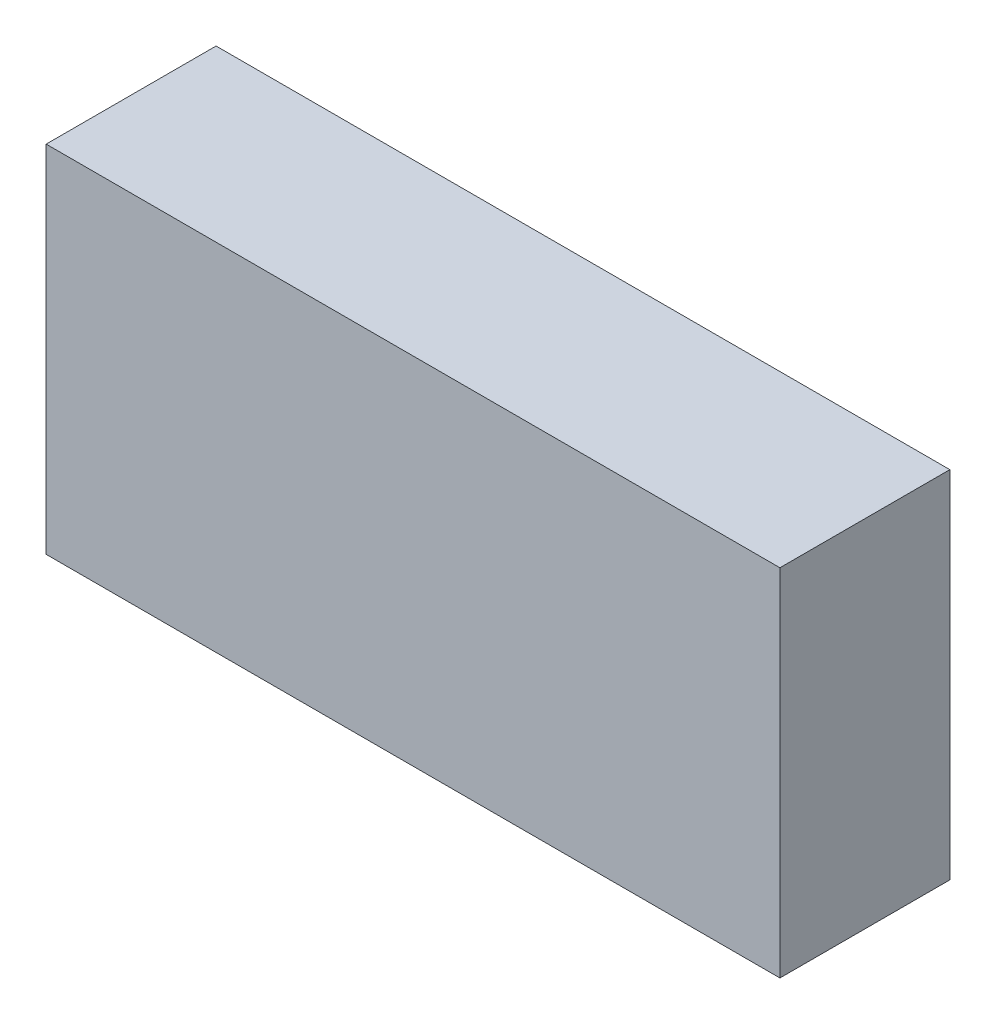
ISO-10303-21;
HEADER;
FILE_DESCRIPTION(('STEP AP214'),'2;1');
FILE_NAME('part.step','',(''),(''),'','','');
FILE_SCHEMA(('AUTOMOTIVE_DESIGN { 1 0 10303 214 1 1 1 1 }'));
ENDSEC;
DATA;
#1=APPLICATION_CONTEXT('core data for automotive mechanical design processes');
#2=APPLICATION_PROTOCOL_DEFINITION('international standard','automotive_design',2000,#1);
#3=PRODUCT_CONTEXT('',#1,'mechanical');
#4=PRODUCT('Part','Part','',(#3));
#5=PRODUCT_RELATED_PRODUCT_CATEGORY('part','',(#4));
#6=PRODUCT_DEFINITION_FORMATION('','',#4);
#7=PRODUCT_DEFINITION_CONTEXT('part definition',#1,'design');
#8=PRODUCT_DEFINITION('design','',#6,#7);
#9=PRODUCT_DEFINITION_SHAPE('','',#8);
#10=(LENGTH_UNIT() NAMED_UNIT(*) SI_UNIT(.MILLI.,.METRE.));
#11=(NAMED_UNIT(*) PLANE_ANGLE_UNIT() SI_UNIT($,.RADIAN.));
#12=(NAMED_UNIT(*) SI_UNIT($,.STERADIAN.) SOLID_ANGLE_UNIT());
#13=UNCERTAINTY_MEASURE_WITH_UNIT(LENGTH_MEASURE(1.E-05),#10,'distance_accuracy_value','');
#14=(GEOMETRIC_REPRESENTATION_CONTEXT(3) GLOBAL_UNCERTAINTY_ASSIGNED_CONTEXT((#13)) GLOBAL_UNIT_ASSIGNED_CONTEXT((#10,
#11,#12)) REPRESENTATION_CONTEXT('',''));
#15=CARTESIAN_POINT('',(0.,0.,0.));
#16=DIRECTION('',(0.,0.,1.));
#17=DIRECTION('',(1.,0.,0.));
#18=AXIS2_PLACEMENT_3D('',#15,#16,#17);
#19=CARTESIAN_POINT('',(47.5,23.,22.));
#20=DIRECTION('',(-1.,0.,0.));
#21=DIRECTION('',(0.,0.,1.));
#22=AXIS2_PLACEMENT_3D('',#19,#20,#21);
#23=PLANE('',#22);
#24=DIRECTION('',(0.,1.,0.));
#25=VECTOR('',#24,1.);
#26=CARTESIAN_POINT('',(47.5,23.,0.));
#27=LINE('',#26,#25);
#28=CARTESIAN_POINT('',(47.5,-23.,0.));
#29=VERTEX_POINT('',#28);
#30=CARTESIAN_POINT('',(47.5,23.,0.));
#31=VERTEX_POINT('',#30);
#32=EDGE_CURVE('E96',#29,#31,#27,.T.);
#33=ORIENTED_EDGE('',*,*,#32,.T.);
#34=DIRECTION('',(0.,0.,-1.));
#35=VECTOR('',#34,1.);
#36=CARTESIAN_POINT('',(47.5,23.,22.));
#37=LINE('',#36,#35);
#38=CARTESIAN_POINT('',(47.5,23.,22.));
#39=VERTEX_POINT('',#38);
#40=EDGE_CURVE('E11',#39,#31,#37,.T.);
#41=ORIENTED_EDGE('',*,*,#40,.F.);
#42=DIRECTION('',(0.,1.,0.));
#43=VECTOR('',#42,1.);
#44=CARTESIAN_POINT('',(47.5,23.,22.));
#45=LINE('',#44,#43);
#46=CARTESIAN_POINT('',(47.5,-23.,22.));
#47=VERTEX_POINT('',#46);
#48=EDGE_CURVE('E84',#47,#39,#45,.T.);
#49=ORIENTED_EDGE('',*,*,#48,.F.);
#50=DIRECTION('',(0.,0.,-1.));
#51=VECTOR('',#50,1.);
#52=CARTESIAN_POINT('',(47.5,-23.,22.));
#53=LINE('',#52,#51);
#54=EDGE_CURVE('E92',#47,#29,#53,.T.);
#55=ORIENTED_EDGE('',*,*,#54,.T.);
#56=EDGE_LOOP('',(#33,#41,#49,#55));
#57=FACE_BOUND('',#56,.T.);
#58=ADVANCED_FACE('F33',(#57),#23,.F.);
#59=CARTESIAN_POINT('',(-47.5,23.,22.));
#60=DIRECTION('',(0.,-1.,0.));
#61=DIRECTION('',(0.,0.,-1.));
#62=AXIS2_PLACEMENT_3D('',#59,#60,#61);
#63=PLANE('',#62);
#64=DIRECTION('',(-1.,0.,0.));
#65=VECTOR('',#64,1.);
#66=CARTESIAN_POINT('',(-47.5,23.,0.));
#67=LINE('',#66,#65);
#68=CARTESIAN_POINT('',(-47.5,23.,0.));
#69=VERTEX_POINT('',#68);
#70=EDGE_CURVE('E88',#31,#69,#67,.T.);
#71=ORIENTED_EDGE('',*,*,#70,.T.);
#72=DIRECTION('',(0.,0.,-1.));
#73=VECTOR('',#72,1.);
#74=CARTESIAN_POINT('',(-47.5,23.,22.));
#75=LINE('',#74,#73);
#76=CARTESIAN_POINT('',(-47.5,23.,22.));
#77=VERTEX_POINT('',#76);
#78=EDGE_CURVE('E41',#77,#69,#75,.T.);
#79=ORIENTED_EDGE('',*,*,#78,.F.);
#80=DIRECTION('',(-1.,0.,0.));
#81=VECTOR('',#80,1.);
#82=CARTESIAN_POINT('',(-47.5,23.,22.));
#83=LINE('',#82,#81);
#84=EDGE_CURVE('E79',#39,#77,#83,.T.);
#85=ORIENTED_EDGE('',*,*,#84,.F.);
#86=ORIENTED_EDGE('',*,*,#40,.T.);
#87=EDGE_LOOP('',(#71,#79,#85,#86));
#88=FACE_BOUND('',#87,.T.);
#89=ADVANCED_FACE('F87',(#88),#63,.F.);
#90=CARTESIAN_POINT('',(-47.5,23.,22.));
#91=DIRECTION('',(1.,0.,0.));
#92=DIRECTION('',(0.,0.,-1.));
#93=AXIS2_PLACEMENT_3D('',#90,#91,#92);
#94=PLANE('',#93);
#95=DIRECTION('',(0.,-1.,0.));
#96=VECTOR('',#95,1.);
#97=CARTESIAN_POINT('',(-47.5,23.,0.));
#98=LINE('',#97,#96);
#99=CARTESIAN_POINT('',(-47.5,-23.,0.));
#100=VERTEX_POINT('',#99);
#101=EDGE_CURVE('E66',#69,#100,#98,.T.);
#102=ORIENTED_EDGE('',*,*,#101,.T.);
#103=DIRECTION('',(0.,0.,-1.));
#104=VECTOR('',#103,1.);
#105=CARTESIAN_POINT('',(-47.5,-23.,22.));
#106=LINE('',#105,#104);
#107=CARTESIAN_POINT('',(-47.5,-23.,22.));
#108=VERTEX_POINT('',#107);
#109=EDGE_CURVE('E89',#108,#100,#106,.T.);
#110=ORIENTED_EDGE('',*,*,#109,.F.);
#111=DIRECTION('',(0.,-1.,0.));
#112=VECTOR('',#111,1.);
#113=CARTESIAN_POINT('',(-47.5,23.,22.));
#114=LINE('',#113,#112);
#115=EDGE_CURVE('E82',#77,#108,#114,.T.);
#116=ORIENTED_EDGE('',*,*,#115,.F.);
#117=ORIENTED_EDGE('',*,*,#78,.T.);
#118=EDGE_LOOP('',(#102,#110,#116,#117));
#119=FACE_BOUND('',#118,.T.);
#120=ADVANCED_FACE('F90',(#119),#94,.F.);
#121=CARTESIAN_POINT('',(-47.5,-23.,22.));
#122=DIRECTION('',(0.,1.,0.));
#123=DIRECTION('',(0.,0.,1.));
#124=AXIS2_PLACEMENT_3D('',#121,#122,#123);
#125=PLANE('',#124);
#126=DIRECTION('',(1.,0.,0.));
#127=VECTOR('',#126,1.);
#128=CARTESIAN_POINT('',(-47.5,-23.,0.));
#129=LINE('',#128,#127);
#130=EDGE_CURVE('E72',#100,#29,#129,.T.);
#131=ORIENTED_EDGE('',*,*,#130,.T.);
#132=ORIENTED_EDGE('',*,*,#54,.F.);
#133=DIRECTION('',(1.,0.,0.));
#134=VECTOR('',#133,1.);
#135=CARTESIAN_POINT('',(-47.5,-23.,22.));
#136=LINE('',#135,#134);
#137=EDGE_CURVE('E49',#108,#47,#136,.T.);
#138=ORIENTED_EDGE('',*,*,#137,.F.);
#139=ORIENTED_EDGE('',*,*,#109,.T.);
#140=EDGE_LOOP('',(#131,#132,#138,#139));
#141=FACE_BOUND('',#140,.T.);
#142=ADVANCED_FACE('F103',(#141),#125,.F.);
#143=CARTESIAN_POINT('',(0.,0.,22.));
#144=DIRECTION('',(0.,0.,1.));
#145=DIRECTION('',(1.,0.,0.));
#146=AXIS2_PLACEMENT_3D('',#143,#144,#145);
#147=PLANE('',#146);
#148=ORIENTED_EDGE('',*,*,#48,.T.);
#149=ORIENTED_EDGE('',*,*,#84,.T.);
#150=ORIENTED_EDGE('',*,*,#115,.T.);
#151=ORIENTED_EDGE('',*,*,#137,.T.);
#152=EDGE_LOOP('',(#148,#149,#150,#151));
#153=FACE_BOUND('',#152,.T.);
#154=ADVANCED_FACE('F80',(#153),#147,.T.);
#155=CARTESIAN_POINT('',(0.,0.,0.));
#156=DIRECTION('',(0.,0.,1.));
#157=DIRECTION('',(1.,0.,0.));
#158=AXIS2_PLACEMENT_3D('',#155,#156,#157);
#159=PLANE('',#158);
#160=ORIENTED_EDGE('',*,*,#32,.F.);
#161=ORIENTED_EDGE('',*,*,#130,.F.);
#162=ORIENTED_EDGE('',*,*,#101,.F.);
#163=ORIENTED_EDGE('',*,*,#70,.F.);
#164=EDGE_LOOP('',(#160,#161,#162,#163));
#165=FACE_BOUND('',#164,.T.);
#166=ADVANCED_FACE('F106',(#165),#159,.F.);
#167=CLOSED_SHELL('',(#58,#89,#120,#142,#154,#166));
#168=MANIFOLD_SOLID_BREP('B2',#167);
#169=ADVANCED_BREP_SHAPE_REPRESENTATION('',(#18,#168),#14);
#170=SHAPE_DEFINITION_REPRESENTATION(#9,#169);
ENDSEC;
END-ISO-10303-21;
